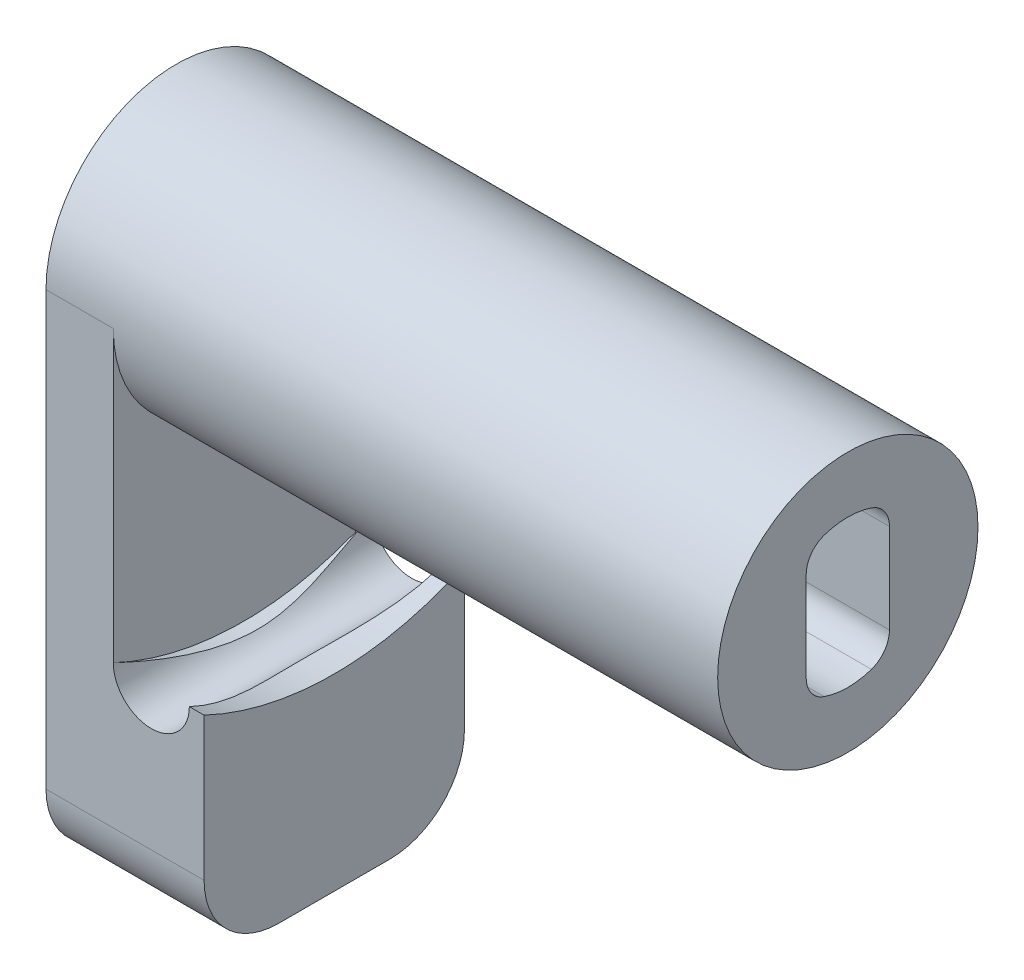
ISO-10303-21;
HEADER;
FILE_DESCRIPTION(('STEP AP214'),'2;1');
FILE_NAME('part.step','',(''),(''),'','','');
FILE_SCHEMA(('AUTOMOTIVE_DESIGN { 1 0 10303 214 1 1 1 1 }'));
ENDSEC;
DATA;
#1=APPLICATION_CONTEXT('core data for automotive mechanical design processes');
#2=APPLICATION_PROTOCOL_DEFINITION('international standard','automotive_design',2000,#1);
#3=PRODUCT_CONTEXT('',#1,'mechanical');
#4=PRODUCT('Part','Part','',(#3));
#5=PRODUCT_RELATED_PRODUCT_CATEGORY('part','',(#4));
#6=PRODUCT_DEFINITION_FORMATION('','',#4);
#7=PRODUCT_DEFINITION_CONTEXT('part definition',#1,'design');
#8=PRODUCT_DEFINITION('design','',#6,#7);
#9=PRODUCT_DEFINITION_SHAPE('','',#8);
#10=(LENGTH_UNIT() NAMED_UNIT(*) SI_UNIT(.MILLI.,.METRE.));
#11=(NAMED_UNIT(*) PLANE_ANGLE_UNIT() SI_UNIT($,.RADIAN.));
#12=(NAMED_UNIT(*) SI_UNIT($,.STERADIAN.) SOLID_ANGLE_UNIT());
#13=UNCERTAINTY_MEASURE_WITH_UNIT(LENGTH_MEASURE(1.E-05),#10,'distance_accuracy_value','');
#14=(GEOMETRIC_REPRESENTATION_CONTEXT(3) GLOBAL_UNCERTAINTY_ASSIGNED_CONTEXT((#13)) GLOBAL_UNIT_ASSIGNED_CONTEXT((#10,
#11,#12)) REPRESENTATION_CONTEXT('',''));
#15=CARTESIAN_POINT('',(0.,0.,0.));
#16=DIRECTION('',(0.,0.,1.));
#17=DIRECTION('',(1.,0.,0.));
#18=AXIS2_PLACEMENT_3D('',#15,#16,#17);
#19=CARTESIAN_POINT('',(-13.1529612058234,-1.08551700717587,0.));
#20=DIRECTION('',(1.,0.,0.));
#21=DIRECTION('',(0.,0.,-1.));
#22=AXIS2_PLACEMENT_3D('',#19,#20,#21);
#23=CYLINDRICAL_SURFACE('',#22,20.32);
#24=CARTESIAN_POINT('',(4.516000112,-19.431,-8.7376));
#25=CARTESIAN_POINT('',(4.51603731749877,-19.5177287528389,-8.5555150718596));
#26=CARTESIAN_POINT('',(4.52041756207572,-19.6017131843481,-8.37218776939642));
#27=CARTESIAN_POINT('',(4.53649669182362,-19.7640441249381,-8.00346974642191));
#28=CARTESIAN_POINT('',(4.54819196914922,-19.8423933921093,-7.81808008733202));
#29=CARTESIAN_POINT('',(4.57750524371221,-19.9932298337656,-7.44587482763609));
#30=CARTESIAN_POINT('',(4.59511059020355,-20.0657291226541,-7.25906309881219));
#31=CARTESIAN_POINT('',(4.6350984527638,-20.2050234726588,-6.88381652494582));
#32=CARTESIAN_POINT('',(4.65748161048571,-20.2718177659139,-6.69538146515752));
#33=CARTESIAN_POINT('',(4.73063386302325,-20.4648184988648,-6.12434180645761));
#34=CARTESIAN_POINT('',(4.78709294470231,-20.5822383370678,-5.73947026967527));
#35=CARTESIAN_POINT('',(4.90685418840569,-20.7938885012978,-4.9642812598655));
#36=CARTESIAN_POINT('',(4.97016061356254,-20.8881042595447,-4.57396052741235));
#37=CARTESIAN_POINT('',(5.09296430268536,-21.0504853530193,-3.80167743454365));
#38=CARTESIAN_POINT('',(5.15251770203577,-21.1194348094891,-3.41988894288582));
#39=CARTESIAN_POINT('',(5.26139557184988,-21.235522973599,-2.65150880361196));
#40=CARTESIAN_POINT('',(5.31072214253996,-21.2826661619228,-2.26491815950602));
#41=CARTESIAN_POINT('',(5.36996981115032,-21.3365954064752,-1.68338288453226));
#42=CARTESIAN_POINT('',(5.38722709898677,-21.3517501970454,-1.48994178039054));
#43=CARTESIAN_POINT('',(5.41595618999079,-21.376527934953,-1.10226762126502));
#44=CARTESIAN_POINT('',(5.42742814364184,-21.3861510261775,-0.908034587012759));
#45=CARTESIAN_POINT('',(5.44384213927347,-21.399814361787,-0.519182820192744));
#46=CARTESIAN_POINT('',(5.4487872492382,-21.4038572292324,-0.324564311936539));
#47=CARTESIAN_POINT('',(5.45182482094318,-21.4063463641171,0.0647645243224691));
#48=CARTESIAN_POINT('',(5.44991713093645,-21.4047925076236,0.25947485426309));
#49=CARTESIAN_POINT('',(5.43791560220297,-21.3949008098425,0.702031122744907));
#50=CARTESIAN_POINT('',(5.42571740508307,-21.3848170128464,0.949783737628716));
#51=CARTESIAN_POINT('',(5.39165308592273,-21.3556506908518,1.44409389752363));
#52=CARTESIAN_POINT('',(5.36978570537389,-21.3365669944351,1.69065128274307));
#53=CARTESIAN_POINT('',(5.31841361275851,-21.2894896279478,2.1824283587983));
#54=CARTESIAN_POINT('',(5.28889873312364,-21.2614840845627,2.42764582157201));
#55=CARTESIAN_POINT('',(5.22459428249614,-21.1966813330368,2.91619580195046));
#56=CARTESIAN_POINT('',(5.18980480135659,-21.1598842746537,3.15952835159059));
#57=CARTESIAN_POINT('',(5.11704832924566,-21.0773221209748,3.64572203666351));
#58=CARTESIAN_POINT('',(5.0790635160548,-21.03150451255,3.88857157186214));
#59=CARTESIAN_POINT('',(5.00229123413209,-20.931076768087,4.37232221506012));
#60=CARTESIAN_POINT('',(4.96350366591518,-20.876465536504,4.61322307635335));
#61=CARTESIAN_POINT('',(4.84906519895848,-20.6995446264881,5.332540827966));
#62=CARTESIAN_POINT('',(4.77524179271125,-20.5640491428703,5.80815334623814));
#63=CARTESIAN_POINT('',(4.68332294902369,-20.3429656895821,6.48856420455001));
#64=CARTESIAN_POINT('',(4.6570609963979,-20.2715032996002,6.69693796652465));
#65=CARTESIAN_POINT('',(4.60994604418476,-20.1216333367819,7.1117720077411));
#66=CARTESIAN_POINT('',(4.58909206679276,-20.0432270229058,7.31823262637574));
#67=CARTESIAN_POINT('',(4.55437450524215,-19.8797799982117,7.72829969041081));
#68=CARTESIAN_POINT('',(4.5404869822015,-19.7947631829191,7.93191353995666));
#69=CARTESIAN_POINT('',(4.52609874323223,-19.6621542658722,8.23548148381315));
#70=CARTESIAN_POINT('',(4.52237634337057,-19.617088565154,8.33639443081653));
#71=CARTESIAN_POINT('',(4.51732854253573,-19.525288679427,8.53753160177582));
#72=CARTESIAN_POINT('',(4.51600340983757,-19.4785543082763,8.63775574739877));
#73=CARTESIAN_POINT('',(4.516000112,-19.431,8.7376));
#74=B_SPLINE_CURVE_WITH_KNOTS('',3,(#24,#25,#26,#27,#28,#29,#30,#31,#32,#33,#34,#35,#36,#37,#38,
#39,#40,#41,#42,#43,#44,#45,#46,#47,#48,#49,#50,#51,#52,#53,#54,#55,#56,#57,#58,#59,#60,#61,#62,
#63,#64,#65,#66,#67,#68,#69,#70,#71,#72,#73),.UNSPECIFIED.,.F.,.F.,(4,2,2,2,2,2,2,2,2,2,2,2,2,2,
2,2,2,2,2,2,2,2,2,2,4),(0.,0.604902094843688,1.20950608108938,1.81282405341211,2.41622310148412,
3.6342575228127,4.8530547015255,6.02995777472376,7.20661891401831,7.79087980929366,
8.37512550645878,8.95909647731702,9.54308037958888,10.2874501190093,11.0319167716234,
11.7773783385945,12.522827208021,13.2727513586984,14.0227690103302,15.5210179611022,
16.1864245199329,16.8517106839849,17.5146947852316,17.8464021322582,18.1781465979217),.UNSPECIFIED.);
#75=CARTESIAN_POINT('',(4.516000112,-19.431,-8.7376));
#76=VERTEX_POINT('',#75);
#77=CARTESIAN_POINT('',(4.516000112,-19.431,8.7376));
#78=VERTEX_POINT('',#77);
#79=EDGE_CURVE('E228',#76,#78,#74,.T.);
#80=ORIENTED_EDGE('',*,*,#79,.F.);
#81=CARTESIAN_POINT('',(4.516000112,-1.08551700717587,0.));
#82=DIRECTION('',(-1.,0.,0.));
#83=DIRECTION('',(0.,0.,1.));
#84=AXIS2_PLACEMENT_3D('',#81,#82,#83);
#85=CIRCLE('',#84,20.32);
#86=EDGE_CURVE('E254',#76,#78,#85,.T.);
#87=ORIENTED_EDGE('',*,*,#86,.T.);
#88=EDGE_LOOP('',(#80,#87));
#89=FACE_BOUND('',#88,.T.);
#90=ADVANCED_FACE('F50',(#89),#23,.F.);
#91=CARTESIAN_POINT('',(45.085,0.,0.));
#92=DIRECTION('',(-1.,0.,0.));
#93=DIRECTION('',(0.,0.,1.));
#94=AXIS2_PLACEMENT_3D('',#91,#92,#93);
#95=CYLINDRICAL_SURFACE('',#94,8.7376);
#96=CARTESIAN_POINT('',(4.516000112,0.,0.));
#97=DIRECTION('',(-1.,0.,0.));
#98=DIRECTION('',(0.,0.,1.));
#99=AXIS2_PLACEMENT_3D('',#96,#97,#98);
#100=CIRCLE('',#99,8.7376);
#101=CARTESIAN_POINT('',(4.516000112,0.,-8.7376));
#102=VERTEX_POINT('',#101);
#103=CARTESIAN_POINT('',(4.516000112,0.,8.7376));
#104=VERTEX_POINT('',#103);
#105=EDGE_CURVE('E283',#102,#104,#100,.T.);
#106=ORIENTED_EDGE('',*,*,#105,.F.);
#107=DIRECTION('',(-1.,0.,0.));
#108=VECTOR('',#107,1.);
#109=CARTESIAN_POINT('',(4.516000112,0.,-8.7376));
#110=LINE('',#109,#108);
#111=CARTESIAN_POINT('',(0.,0.,-8.7376));
#112=VERTEX_POINT('',#111);
#113=EDGE_CURVE('E297',#102,#112,#110,.T.);
#114=ORIENTED_EDGE('',*,*,#113,.T.);
#115=CARTESIAN_POINT('',(0.,0.,0.));
#116=DIRECTION('',(1.,0.,0.));
#117=DIRECTION('',(0.,0.,-1.));
#118=AXIS2_PLACEMENT_3D('',#115,#116,#117);
#119=CIRCLE('',#118,8.7376);
#120=CARTESIAN_POINT('',(0.,0.,8.7376));
#121=VERTEX_POINT('',#120);
#122=EDGE_CURVE('E301',#112,#121,#119,.T.);
#123=ORIENTED_EDGE('',*,*,#122,.T.);
#124=DIRECTION('',(-1.,0.,0.));
#125=VECTOR('',#124,1.);
#126=CARTESIAN_POINT('',(4.516000112,0.,8.7376));
#127=LINE('',#126,#125);
#128=EDGE_CURVE('E287',#104,#121,#127,.T.);
#129=ORIENTED_EDGE('',*,*,#128,.F.);
#130=EDGE_LOOP('',(#106,#114,#123,#129));
#131=FACE_BOUND('',#130,.T.);
#132=CARTESIAN_POINT('',(45.085,0.,0.));
#133=DIRECTION('',(1.,0.,0.));
#134=DIRECTION('',(0.,0.,-1.));
#135=AXIS2_PLACEMENT_3D('',#132,#133,#134);
#136=CIRCLE('',#135,8.7376);
#137=CARTESIAN_POINT('',(45.085,0.,-8.7376));
#138=VERTEX_POINT('',#137);
#139=EDGE_CURVE('E305',#138,#138,#136,.T.);
#140=ORIENTED_EDGE('',*,*,#139,.F.);
#141=EDGE_LOOP('',(#140));
#142=FACE_BOUND('',#141,.T.);
#143=ADVANCED_FACE('F431',(#131,#142),#95,.T.);
#144=CARTESIAN_POINT('',(45.085,0.,0.));
#145=DIRECTION('',(1.,0.,0.));
#146=DIRECTION('',(0.,0.,-1.));
#147=AXIS2_PLACEMENT_3D('',#144,#145,#146);
#148=PLANE('',#147);
#149=CARTESIAN_POINT('',(45.085,0.,0.));
#150=DIRECTION('',(1.,0.,0.));
#151=DIRECTION('',(0.,0.,-1.));
#152=AXIS2_PLACEMENT_3D('',#149,#150,#151);
#153=CIRCLE('',#152,4.953);
#154=CARTESIAN_POINT('',(45.085,4.69255908842926,-1.58496));
#155=VERTEX_POINT('',#154);
#156=CARTESIAN_POINT('',(45.085,4.69255908842926,1.58496));
#157=VERTEX_POINT('',#156);
#158=EDGE_CURVE('E539',#155,#157,#153,.T.);
#159=ORIENTED_EDGE('',*,*,#158,.F.);
#160=CARTESIAN_POINT('',(45.085,3.00805069771106,-1.016));
#161=DIRECTION('',(1.,0.,0.));
#162=DIRECTION('',(0.,0.,-1.));
#163=AXIS2_PLACEMENT_3D('',#160,#161,#162);
#164=CIRCLE('',#163,1.778);
#165=CARTESIAN_POINT('',(45.085,3.00805069771106,-2.794));
#166=VERTEX_POINT('',#165);
#167=EDGE_CURVE('E372',#155,#166,#164,.F.);
#168=ORIENTED_EDGE('',*,*,#167,.T.);
#169=DIRECTION('',(0.,1.,0.));
#170=VECTOR('',#169,1.);
#171=CARTESIAN_POINT('',(45.085,-4.08971551577857,-2.794));
#172=LINE('',#171,#170);
#173=CARTESIAN_POINT('',(45.085,-3.00805069771106,-2.794));
#174=VERTEX_POINT('',#173);
#175=EDGE_CURVE('E546',#174,#166,#172,.T.);
#176=ORIENTED_EDGE('',*,*,#175,.F.);
#177=CARTESIAN_POINT('',(45.085,-3.00805069771106,-1.016));
#178=DIRECTION('',(1.,0.,0.));
#179=DIRECTION('',(0.,0.,-1.));
#180=AXIS2_PLACEMENT_3D('',#177,#178,#179);
#181=CIRCLE('',#180,1.778);
#182=CARTESIAN_POINT('',(45.085,-4.69255908842926,-1.58496));
#183=VERTEX_POINT('',#182);
#184=EDGE_CURVE('E378',#174,#183,#181,.F.);
#185=ORIENTED_EDGE('',*,*,#184,.T.);
#186=CARTESIAN_POINT('',(45.085,0.,0.));
#187=DIRECTION('',(1.,0.,0.));
#188=DIRECTION('',(0.,0.,-1.));
#189=AXIS2_PLACEMENT_3D('',#186,#187,#188);
#190=CIRCLE('',#189,4.953);
#191=CARTESIAN_POINT('',(45.085,-4.69255908842926,1.58496));
#192=VERTEX_POINT('',#191);
#193=EDGE_CURVE('E565',#192,#183,#190,.T.);
#194=ORIENTED_EDGE('',*,*,#193,.F.);
#195=CARTESIAN_POINT('',(45.085,-3.00805069771106,1.016));
#196=DIRECTION('',(1.,0.,0.));
#197=DIRECTION('',(0.,0.,-1.));
#198=AXIS2_PLACEMENT_3D('',#195,#196,#197);
#199=CIRCLE('',#198,1.778);
#200=CARTESIAN_POINT('',(45.085,-3.00805069771106,2.794));
#201=VERTEX_POINT('',#200);
#202=EDGE_CURVE('E229',#192,#201,#199,.F.);
#203=ORIENTED_EDGE('',*,*,#202,.T.);
#204=DIRECTION('',(0.,-1.,0.));
#205=VECTOR('',#204,1.);
#206=CARTESIAN_POINT('',(45.085,-4.08971551577857,2.794));
#207=LINE('',#206,#205);
#208=CARTESIAN_POINT('',(45.085,3.00805069771106,2.794));
#209=VERTEX_POINT('',#208);
#210=EDGE_CURVE('E561',#209,#201,#207,.T.);
#211=ORIENTED_EDGE('',*,*,#210,.F.);
#212=CARTESIAN_POINT('',(45.085,3.00805069771106,1.016));
#213=DIRECTION('',(1.,0.,0.));
#214=DIRECTION('',(0.,0.,-1.));
#215=AXIS2_PLACEMENT_3D('',#212,#213,#214);
#216=CIRCLE('',#215,1.778);
#217=EDGE_CURVE('E375',#209,#157,#216,.F.);
#218=ORIENTED_EDGE('',*,*,#217,.T.);
#219=EDGE_LOOP('',(#159,#168,#176,#185,#194,#203,#211,#218));
#220=FACE_BOUND('',#219,.T.);
#221=ORIENTED_EDGE('',*,*,#139,.T.);
#222=EDGE_LOOP('',(#221));
#223=FACE_BOUND('',#222,.T.);
#224=ADVANCED_FACE('F438',(#220,#223),#148,.T.);
#225=CARTESIAN_POINT('',(0.,0.,0.));
#226=DIRECTION('',(1.,0.,0.));
#227=DIRECTION('',(0.,0.,-1.));
#228=AXIS2_PLACEMENT_3D('',#225,#226,#227);
#229=PLANE('',#228);
#230=CARTESIAN_POINT('',(0.,0.,0.));
#231=DIRECTION('',(-1.,0.,0.));
#232=DIRECTION('',(0.,0.,1.));
#233=AXIS2_PLACEMENT_3D('',#230,#231,#232);
#234=CIRCLE('',#233,4.064);
#235=CARTESIAN_POINT('',(0.,-3.57996192448434,1.92353024911032));
#236=VERTEX_POINT('',#235);
#237=CARTESIAN_POINT('',(0.,-3.57996192448434,-1.92353024911032));
#238=VERTEX_POINT('',#237);
#239=EDGE_CURVE('E530',#236,#238,#234,.T.);
#240=ORIENTED_EDGE('',*,*,#239,.F.);
#241=CARTESIAN_POINT('',(0.,-3.92956758117226,2.111375));
#242=DIRECTION('',(1.,0.,0.));
#243=DIRECTION('',(0.,0.,-1.));
#244=AXIS2_PLACEMENT_3D('',#241,#242,#243);
#245=CIRCLE('',#244,0.396875);
#246=CARTESIAN_POINT('',(0.,-3.92956758117226,1.7145));
#247=VERTEX_POINT('',#246);
#248=EDGE_CURVE('E457',#236,#247,#245,.F.);
#249=ORIENTED_EDGE('',*,*,#248,.T.);
#250=DIRECTION('',(0.,1.,0.));
#251=VECTOR('',#250,1.);
#252=CARTESIAN_POINT('',(0.,-3.68464187540662,1.7145));
#253=LINE('',#252,#251);
#254=CARTESIAN_POINT('',(0.,-5.19276687540662,1.7145));
#255=VERTEX_POINT('',#254);
#256=EDGE_CURVE('E501',#255,#247,#253,.T.);
#257=ORIENTED_EDGE('',*,*,#256,.F.);
#258=CARTESIAN_POINT('',(0.,-5.19276687540662,1.317625));
#259=DIRECTION('',(1.,0.,0.));
#260=DIRECTION('',(0.,0.,-1.));
#261=AXIS2_PLACEMENT_3D('',#258,#259,#260);
#262=CIRCLE('',#261,0.396875);
#263=CARTESIAN_POINT('',(0.,-5.58964187540662,1.317625));
#264=VERTEX_POINT('',#263);
#265=EDGE_CURVE('E489',#255,#264,#262,.T.);
#266=ORIENTED_EDGE('',*,*,#265,.T.);
#267=DIRECTION('',(0.,0.,1.));
#268=VECTOR('',#267,1.);
#269=CARTESIAN_POINT('',(0.,-5.58964187540662,1.7145));
#270=LINE('',#269,#268);
#271=CARTESIAN_POINT('',(0.,-5.58964187540662,-1.317625));
#272=VERTEX_POINT('',#271);
#273=EDGE_CURVE('E499',#272,#264,#270,.T.);
#274=ORIENTED_EDGE('',*,*,#273,.F.);
#275=CARTESIAN_POINT('',(0.,-5.19276687540662,-1.317625));
#276=DIRECTION('',(1.,0.,0.));
#277=DIRECTION('',(0.,0.,-1.));
#278=AXIS2_PLACEMENT_3D('',#275,#276,#277);
#279=CIRCLE('',#278,0.396875);
#280=CARTESIAN_POINT('',(0.,-5.19276687540662,-1.7145));
#281=VERTEX_POINT('',#280);
#282=EDGE_CURVE('E12',#272,#281,#279,.T.);
#283=ORIENTED_EDGE('',*,*,#282,.T.);
#284=DIRECTION('',(0.,-1.,0.));
#285=VECTOR('',#284,1.);
#286=CARTESIAN_POINT('',(0.,-3.68464187540662,-1.7145));
#287=LINE('',#286,#285);
#288=CARTESIAN_POINT('',(0.,-3.92956758117226,-1.7145));
#289=VERTEX_POINT('',#288);
#290=EDGE_CURVE('E511',#289,#281,#287,.T.);
#291=ORIENTED_EDGE('',*,*,#290,.F.);
#292=CARTESIAN_POINT('',(0.,-3.92956758117226,-2.111375));
#293=DIRECTION('',(1.,0.,0.));
#294=DIRECTION('',(0.,0.,-1.));
#295=AXIS2_PLACEMENT_3D('',#292,#293,#294);
#296=CIRCLE('',#295,0.396875);
#297=EDGE_CURVE('E452',#289,#238,#296,.F.);
#298=ORIENTED_EDGE('',*,*,#297,.T.);
#299=EDGE_LOOP('',(#240,#249,#257,#266,#274,#283,#291,#298));
#300=FACE_BOUND('',#299,.T.);
#301=DIRECTION('',(0.,0.,-1.));
#302=VECTOR('',#301,1.);
#303=CARTESIAN_POINT('',(0.,-34.036,0.));
#304=LINE('',#303,#302);
#305=CARTESIAN_POINT('',(0.,-34.036,3.7376));
#306=VERTEX_POINT('',#305);
#307=CARTESIAN_POINT('',(0.,-34.036,-3.7376));
#308=VERTEX_POINT('',#307);
#309=EDGE_CURVE('E290',#306,#308,#304,.T.);
#310=ORIENTED_EDGE('',*,*,#309,.F.);
#311=CARTESIAN_POINT('',(0.,-29.036,3.7376));
#312=DIRECTION('',(1.,0.,0.));
#313=DIRECTION('',(0.,0.,-1.));
#314=AXIS2_PLACEMENT_3D('',#311,#312,#313);
#315=CIRCLE('',#314,5.);
#316=CARTESIAN_POINT('',(0.,-29.036,8.7376));
#317=VERTEX_POINT('',#316);
#318=EDGE_CURVE('E321',#306,#317,#315,.F.);
#319=ORIENTED_EDGE('',*,*,#318,.T.);
#320=DIRECTION('',(0.,-1.,0.));
#321=VECTOR('',#320,1.);
#322=CARTESIAN_POINT('',(0.,0.,8.7376));
#323=LINE('',#322,#321);
#324=EDGE_CURVE('E279',#121,#317,#323,.T.);
#325=ORIENTED_EDGE('',*,*,#324,.F.);
#326=ORIENTED_EDGE('',*,*,#122,.F.);
#327=DIRECTION('',(0.,1.,0.));
#328=VECTOR('',#327,1.);
#329=CARTESIAN_POINT('',(0.,0.,-8.7376));
#330=LINE('',#329,#328);
#331=CARTESIAN_POINT('',(0.,-29.036,-8.7376));
#332=VERTEX_POINT('',#331);
#333=EDGE_CURVE('E275',#332,#112,#330,.T.);
#334=ORIENTED_EDGE('',*,*,#333,.F.);
#335=CARTESIAN_POINT('',(0.,-29.036,-3.7376));
#336=DIRECTION('',(1.,0.,0.));
#337=DIRECTION('',(0.,0.,-1.));
#338=AXIS2_PLACEMENT_3D('',#335,#336,#337);
#339=CIRCLE('',#338,5.);
#340=EDGE_CURVE('E318',#332,#308,#339,.F.);
#341=ORIENTED_EDGE('',*,*,#340,.T.);
#342=EDGE_LOOP('',(#310,#319,#325,#326,#334,#341));
#343=FACE_BOUND('',#342,.T.);
#344=ADVANCED_FACE('F497',(#300,#343),#229,.F.);
#345=CARTESIAN_POINT('',(4.516000112,0.,-8.7376));
#346=DIRECTION('',(0.,0.,1.));
#347=DIRECTION('',(0.,-1.,0.));
#348=AXIS2_PLACEMENT_3D('',#345,#346,#347);
#349=PLANE('',#348);
#350=DIRECTION('',(0.,1.,0.));
#351=VECTOR('',#350,1.);
#352=CARTESIAN_POINT('',(4.516000112,0.,-8.7376));
#353=LINE('',#352,#351);
#354=EDGE_CURVE('E238',#76,#102,#353,.T.);
#355=ORIENTED_EDGE('',*,*,#354,.F.);
#356=CARTESIAN_POINT('',(7.068700112,-19.431,-8.7376));
#357=DIRECTION('',(0.,0.,-1.));
#358=DIRECTION('',(0.,1.,0.));
#359=AXIS2_PLACEMENT_3D('',#356,#357,#358);
#360=CIRCLE('',#359,2.5527);
#361=CARTESIAN_POINT('',(9.621400112,-19.431,-8.7376));
#362=VERTEX_POINT('',#361);
#363=EDGE_CURVE('E220',#362,#76,#360,.T.);
#364=ORIENTED_EDGE('',*,*,#363,.F.);
#365=DIRECTION('',(1.,0.,0.));
#366=VECTOR('',#365,1.);
#367=CARTESIAN_POINT('',(-13.1529612058234,-19.431,-8.7376));
#368=LINE('',#367,#366);
#369=CARTESIAN_POINT('',(10.612000112,-19.431,-8.7376));
#370=VERTEX_POINT('',#369);
#371=EDGE_CURVE('E235',#362,#370,#368,.T.);
#372=ORIENTED_EDGE('',*,*,#371,.T.);
#373=DIRECTION('',(0.,1.,0.));
#374=VECTOR('',#373,1.);
#375=CARTESIAN_POINT('',(10.612000112,0.,-8.7376));
#376=LINE('',#375,#374);
#377=CARTESIAN_POINT('',(10.612000112,-29.036,-8.7376));
#378=VERTEX_POINT('',#377);
#379=EDGE_CURVE('E272',#378,#370,#376,.T.);
#380=ORIENTED_EDGE('',*,*,#379,.F.);
#381=DIRECTION('',(-1.,0.,0.));
#382=VECTOR('',#381,1.);
#383=CARTESIAN_POINT('',(4.516000112,-29.036,-8.7376));
#384=LINE('',#383,#382);
#385=EDGE_CURVE('E328',#378,#332,#384,.T.);
#386=ORIENTED_EDGE('',*,*,#385,.T.);
#387=ORIENTED_EDGE('',*,*,#333,.T.);
#388=ORIENTED_EDGE('',*,*,#113,.F.);
#389=EDGE_LOOP('',(#355,#364,#372,#380,#386,#387,#388));
#390=FACE_BOUND('',#389,.T.);
#391=ADVANCED_FACE('F233',(#390),#349,.F.);
#392=CARTESIAN_POINT('',(4.516000112,0.,8.7376));
#393=DIRECTION('',(0.,0.,-1.));
#394=DIRECTION('',(0.,1.,0.));
#395=AXIS2_PLACEMENT_3D('',#392,#393,#394);
#396=PLANE('',#395);
#397=DIRECTION('',(1.,0.,0.));
#398=VECTOR('',#397,1.);
#399=CARTESIAN_POINT('',(-13.1529612058234,-19.431,8.7376));
#400=LINE('',#399,#398);
#401=CARTESIAN_POINT('',(9.621400112,-19.431,8.7376));
#402=VERTEX_POINT('',#401);
#403=CARTESIAN_POINT('',(10.612000112,-19.431,8.7376));
#404=VERTEX_POINT('',#403);
#405=EDGE_CURVE('E248',#402,#404,#400,.T.);
#406=ORIENTED_EDGE('',*,*,#405,.F.);
#407=CARTESIAN_POINT('',(7.068700112,-19.431,8.7376));
#408=DIRECTION('',(0.,0.,-1.));
#409=DIRECTION('',(0.,1.,0.));
#410=AXIS2_PLACEMENT_3D('',#407,#408,#409);
#411=CIRCLE('',#410,2.5527);
#412=EDGE_CURVE('E223',#402,#78,#411,.T.);
#413=ORIENTED_EDGE('',*,*,#412,.T.);
#414=DIRECTION('',(0.,-1.,0.));
#415=VECTOR('',#414,1.);
#416=CARTESIAN_POINT('',(4.516000112,0.,8.7376));
#417=LINE('',#416,#415);
#418=EDGE_CURVE('E278',#104,#78,#417,.T.);
#419=ORIENTED_EDGE('',*,*,#418,.F.);
#420=ORIENTED_EDGE('',*,*,#128,.T.);
#421=ORIENTED_EDGE('',*,*,#324,.T.);
#422=DIRECTION('',(-1.,0.,0.));
#423=VECTOR('',#422,1.);
#424=CARTESIAN_POINT('',(4.516000112,-29.036,8.7376));
#425=LINE('',#424,#423);
#426=CARTESIAN_POINT('',(10.612000112,-29.036,8.7376));
#427=VERTEX_POINT('',#426);
#428=EDGE_CURVE('E324',#317,#427,#425,.F.);
#429=ORIENTED_EDGE('',*,*,#428,.T.);
#430=DIRECTION('',(0.,-1.,0.));
#431=VECTOR('',#430,1.);
#432=CARTESIAN_POINT('',(10.612000112,0.,8.7376));
#433=LINE('',#432,#431);
#434=EDGE_CURVE('E252',#404,#427,#433,.T.);
#435=ORIENTED_EDGE('',*,*,#434,.F.);
#436=EDGE_LOOP('',(#406,#413,#419,#420,#421,#429,#435));
#437=FACE_BOUND('',#436,.T.);
#438=ADVANCED_FACE('F798',(#437),#396,.F.);
#439=CARTESIAN_POINT('',(4.516000112,-34.036,0.));
#440=DIRECTION('',(0.,1.,0.));
#441=DIRECTION('',(0.,0.,1.));
#442=AXIS2_PLACEMENT_3D('',#439,#440,#441);
#443=PLANE('',#442);
#444=DIRECTION('',(-1.,0.,0.));
#445=VECTOR('',#444,1.);
#446=CARTESIAN_POINT('',(4.516000112,-34.036,-3.7376));
#447=LINE('',#446,#445);
#448=CARTESIAN_POINT('',(10.612000112,-34.036,-3.7376));
#449=VERTEX_POINT('',#448);
#450=EDGE_CURVE('E309',#308,#449,#447,.F.);
#451=ORIENTED_EDGE('',*,*,#450,.T.);
#452=DIRECTION('',(0.,0.,-1.));
#453=VECTOR('',#452,1.);
#454=CARTESIAN_POINT('',(10.612000112,-34.036,0.));
#455=LINE('',#454,#453);
#456=CARTESIAN_POINT('',(10.612000112,-34.036,3.7376));
#457=VERTEX_POINT('',#456);
#458=EDGE_CURVE('E264',#457,#449,#455,.T.);
#459=ORIENTED_EDGE('',*,*,#458,.F.);
#460=DIRECTION('',(-1.,0.,0.));
#461=VECTOR('',#460,1.);
#462=CARTESIAN_POINT('',(4.516000112,-34.036,3.7376));
#463=LINE('',#462,#461);
#464=EDGE_CURVE('E314',#457,#306,#463,.T.);
#465=ORIENTED_EDGE('',*,*,#464,.T.);
#466=ORIENTED_EDGE('',*,*,#309,.T.);
#467=EDGE_LOOP('',(#451,#459,#465,#466));
#468=FACE_BOUND('',#467,.T.);
#469=ADVANCED_FACE('F789',(#468),#443,.F.);
#470=CARTESIAN_POINT('',(4.516000112,0.,0.));
#471=DIRECTION('',(-1.,0.,0.));
#472=DIRECTION('',(0.,0.,1.));
#473=AXIS2_PLACEMENT_3D('',#470,#471,#472);
#474=PLANE('',#473);
#475=ORIENTED_EDGE('',*,*,#418,.T.);
#476=ORIENTED_EDGE('',*,*,#86,.F.);
#477=ORIENTED_EDGE('',*,*,#354,.T.);
#478=ORIENTED_EDGE('',*,*,#105,.T.);
#479=EDGE_LOOP('',(#475,#476,#477,#478));
#480=FACE_BOUND('',#479,.T.);
#481=ADVANCED_FACE('F614',(#480),#474,.F.);
#482=CARTESIAN_POINT('',(4.516000112,-29.036,3.7376));
#483=DIRECTION('',(-1.,0.,0.));
#484=DIRECTION('',(0.,0.,1.));
#485=AXIS2_PLACEMENT_3D('',#482,#483,#484);
#486=CYLINDRICAL_SURFACE('',#485,5.);
#487=ORIENTED_EDGE('',*,*,#464,.F.);
#488=CARTESIAN_POINT('',(10.612000112,-29.036,3.7376));
#489=DIRECTION('',(1.,0.,0.));
#490=DIRECTION('',(0.,0.,-1.));
#491=AXIS2_PLACEMENT_3D('',#488,#489,#490);
#492=CIRCLE('',#491,5.);
#493=EDGE_CURVE('E260',#427,#457,#492,.T.);
#494=ORIENTED_EDGE('',*,*,#493,.F.);
#495=ORIENTED_EDGE('',*,*,#428,.F.);
#496=ORIENTED_EDGE('',*,*,#318,.F.);
#497=EDGE_LOOP('',(#487,#494,#495,#496));
#498=FACE_BOUND('',#497,.T.);
#499=ADVANCED_FACE('F610',(#498),#486,.T.);
#500=CARTESIAN_POINT('',(4.516000112,-29.036,-3.7376));
#501=DIRECTION('',(-1.,0.,0.));
#502=DIRECTION('',(0.,0.,1.));
#503=AXIS2_PLACEMENT_3D('',#500,#501,#502);
#504=CYLINDRICAL_SURFACE('',#503,5.);
#505=ORIENTED_EDGE('',*,*,#385,.F.);
#506=CARTESIAN_POINT('',(10.612000112,-29.036,-3.7376));
#507=DIRECTION('',(1.,0.,0.));
#508=DIRECTION('',(0.,0.,-1.));
#509=AXIS2_PLACEMENT_3D('',#506,#507,#508);
#510=CIRCLE('',#509,5.);
#511=EDGE_CURVE('E268',#449,#378,#510,.T.);
#512=ORIENTED_EDGE('',*,*,#511,.F.);
#513=ORIENTED_EDGE('',*,*,#450,.F.);
#514=ORIENTED_EDGE('',*,*,#340,.F.);
#515=EDGE_LOOP('',(#505,#512,#513,#514));
#516=FACE_BOUND('',#515,.T.);
#517=ADVANCED_FACE('F613',(#516),#504,.T.);
#518=CARTESIAN_POINT('',(10.612000112,0.,0.));
#519=DIRECTION('',(1.,0.,0.));
#520=DIRECTION('',(0.,0.,-1.));
#521=AXIS2_PLACEMENT_3D('',#518,#519,#520);
#522=PLANE('',#521);
#523=ORIENTED_EDGE('',*,*,#379,.T.);
#524=CARTESIAN_POINT('',(10.612000112,-1.08551700717587,0.));
#525=DIRECTION('',(1.,0.,0.));
#526=DIRECTION('',(0.,0.,-1.));
#527=AXIS2_PLACEMENT_3D('',#524,#525,#526);
#528=CIRCLE('',#527,20.32);
#529=EDGE_CURVE('E245',#370,#404,#528,.F.);
#530=ORIENTED_EDGE('',*,*,#529,.T.);
#531=ORIENTED_EDGE('',*,*,#434,.T.);
#532=ORIENTED_EDGE('',*,*,#493,.T.);
#533=ORIENTED_EDGE('',*,*,#458,.T.);
#534=ORIENTED_EDGE('',*,*,#511,.T.);
#535=EDGE_LOOP('',(#523,#530,#531,#532,#533,#534));
#536=FACE_BOUND('',#535,.T.);
#537=ADVANCED_FACE('F428',(#536),#522,.T.);
#538=CARTESIAN_POINT('',(9.621400112,-19.431,8.73760000000001));
#539=CARTESIAN_POINT('',(9.62136290650122,-19.5177287528389,8.55551507185961));
#540=CARTESIAN_POINT('',(9.61698266192428,-19.6017131843481,8.37218776939643));
#541=CARTESIAN_POINT('',(9.60090353217638,-19.7640441249381,8.00346974642192));
#542=CARTESIAN_POINT('',(9.58920825485078,-19.8423933921093,7.81808008733204));
#543=CARTESIAN_POINT('',(9.55989498028779,-19.9932298337656,7.4458748276361));
#544=CARTESIAN_POINT('',(9.54228963379645,-20.0657291226541,7.25906309881221));
#545=CARTESIAN_POINT('',(9.5023017712362,-20.2050234726588,6.88381652494584));
#546=CARTESIAN_POINT('',(9.47991861351429,-20.2718177659139,6.69538146515754));
#547=CARTESIAN_POINT('',(9.40676636097675,-20.4648184988648,6.12434180645763));
#548=CARTESIAN_POINT('',(9.35030727929769,-20.5822383370678,5.73947026967529));
#549=CARTESIAN_POINT('',(9.23054603559431,-20.7938885012978,4.96428125986553));
#550=CARTESIAN_POINT('',(9.16723961043746,-20.8881042595446,4.57396052741238));
#551=CARTESIAN_POINT('',(9.04443592131464,-21.0504853530193,3.80167743454368));
#552=CARTESIAN_POINT('',(8.98488252196424,-21.1194348094891,3.41988894288584));
#553=CARTESIAN_POINT('',(8.87600465215012,-21.235522973599,2.65150880361197));
#554=CARTESIAN_POINT('',(8.82667808146003,-21.2826661619228,2.26491815950603));
#555=CARTESIAN_POINT('',(8.76743041284968,-21.3365954064752,1.68338288453227));
#556=CARTESIAN_POINT('',(8.75017312501324,-21.3517501970454,1.48994178039055));
#557=CARTESIAN_POINT('',(8.72144403400921,-21.376527934953,1.10226762126502));
#558=CARTESIAN_POINT('',(8.70997208035815,-21.3861510261775,0.908034587012754));
#559=CARTESIAN_POINT('',(8.69355808472652,-21.399814361787,0.519182820192736));
#560=CARTESIAN_POINT('',(8.6886129747618,-21.4038572292324,0.324564311936529));
#561=CARTESIAN_POINT('',(8.68557540305681,-21.4063463641171,-0.0647645243224828));
#562=CARTESIAN_POINT('',(8.68748309306355,-21.4047925076236,-0.259474854263106));
#563=CARTESIAN_POINT('',(8.69948462179703,-21.3949008098425,-0.702031122744926));
#564=CARTESIAN_POINT('',(8.71168281891693,-21.3848170128464,-0.949783737628736));
#565=CARTESIAN_POINT('',(8.74574713807727,-21.3556506908518,-1.44409389752365));
#566=CARTESIAN_POINT('',(8.76761451862611,-21.3365669944351,-1.69065128274309));
#567=CARTESIAN_POINT('',(8.8189866112415,-21.2894896279478,-2.18242835879833));
#568=CARTESIAN_POINT('',(8.84850149087637,-21.2614840845627,-2.42764582157203));
#569=CARTESIAN_POINT('',(8.91280594150386,-21.1966813330368,-2.91619580195049));
#570=CARTESIAN_POINT('',(8.94759542264341,-21.1598842746537,-3.15952835159061));
#571=CARTESIAN_POINT('',(9.02035189475434,-21.0773221209747,-3.64572203666354));
#572=CARTESIAN_POINT('',(9.0583367079452,-21.0315045125499,-3.88857157186217));
#573=CARTESIAN_POINT('',(9.13510898986792,-20.931076768087,-4.37232221506015));
#574=CARTESIAN_POINT('',(9.17389655808482,-20.876465536504,-4.61322307635338));
#575=CARTESIAN_POINT('',(9.28833502504152,-20.6995446264881,-5.33254082796604));
#576=CARTESIAN_POINT('',(9.36215843128875,-20.5640491428703,-5.80815334623818));
#577=CARTESIAN_POINT('',(9.45407727497632,-20.3429656895821,-6.48856420455005));
#578=CARTESIAN_POINT('',(9.4803392276021,-20.2715032996002,-6.69693796652469));
#579=CARTESIAN_POINT('',(9.52745417981524,-20.1216333367819,-7.11177200774113));
#580=CARTESIAN_POINT('',(9.54830815720724,-20.0432270229058,-7.31823262637576));
#581=CARTESIAN_POINT('',(9.58302571875785,-19.8797799982117,-7.72829969041083));
#582=CARTESIAN_POINT('',(9.59691324179849,-19.7947631829191,-7.93191353995668));
#583=CARTESIAN_POINT('',(9.61130148076776,-19.6621542658722,-8.23548148381315));
#584=CARTESIAN_POINT('',(9.61502388062943,-19.617088565154,-8.33639443081653));
#585=CARTESIAN_POINT('',(9.62007168146426,-19.525288679427,-8.53753160177582));
#586=CARTESIAN_POINT('',(9.62139681416243,-19.4785543082763,-8.63775574739877));
#587=CARTESIAN_POINT('',(9.621400112,-19.431,-8.7376));
#588=B_SPLINE_CURVE_WITH_KNOTS('',3,(#538,#539,#540,#541,#542,#543,#544,#545,#546,#547,#548,
#549,#550,#551,#552,#553,#554,#555,#556,#557,#558,#559,#560,#561,#562,#563,#564,#565,#566,#567,
#568,#569,#570,#571,#572,#573,#574,#575,#576,#577,#578,#579,#580,#581,#582,#583,#584,#585,#586,
#587),.UNSPECIFIED.,.F.,.F.,(4,2,2,2,2,2,2,2,2,2,2,2,2,2,2,2,2,2,2,2,2,2,2,2,4),(0.,
0.604902094843686,1.20950608108937,1.81282405341211,2.41622310148411,3.63425752281268,
4.85305470152548,6.02995777472375,7.20661891401831,7.79087980929367,8.37512550645879,
8.95909647731704,9.5430803795889,10.2874501190093,11.0319167716235,11.7773783385945,
12.5228272080211,13.2727513586984,14.0227690103302,15.5210179611022,16.1864245199329,
16.851710683985,17.5146947852316,17.8464021322582,18.1781465979217),.UNSPECIFIED.);
#589=EDGE_CURVE('E217',#402,#362,#588,.T.);
#590=ORIENTED_EDGE('',*,*,#589,.F.);
#591=ORIENTED_EDGE('',*,*,#405,.T.);
#592=ORIENTED_EDGE('',*,*,#529,.F.);
#593=ORIENTED_EDGE('',*,*,#371,.F.);
#594=EDGE_LOOP('',(#590,#591,#592,#593));
#595=FACE_BOUND('',#594,.T.);
#596=ADVANCED_FACE('F243',(#595),#23,.F.);
#597=CARTESIAN_POINT('',(32.893,0.,0.));
#598=DIRECTION('',(1.,0.,0.));
#599=DIRECTION('',(0.,0.,-1.));
#600=AXIS2_PLACEMENT_3D('',#597,#598,#599);
#601=CYLINDRICAL_SURFACE('',#600,4.953);
#602=CARTESIAN_POINT('',(32.893,0.,0.));
#603=DIRECTION('',(1.,0.,0.));
#604=DIRECTION('',(0.,0.,-1.));
#605=AXIS2_PLACEMENT_3D('',#602,#603,#604);
#606=CIRCLE('',#605,4.953);
#607=CARTESIAN_POINT('',(32.893,4.69255908842926,-1.58496));
#608=VERTEX_POINT('',#607);
#609=CARTESIAN_POINT('',(32.893,4.69255908842926,1.58496));
#610=VERTEX_POINT('',#609);
#611=EDGE_CURVE('E541',#608,#610,#606,.T.);
#612=ORIENTED_EDGE('',*,*,#611,.F.);
#613=DIRECTION('',(1.,0.,0.));
#614=VECTOR('',#613,1.);
#615=CARTESIAN_POINT('',(32.893,4.69255908842926,-1.58496));
#616=LINE('',#615,#614);
#617=EDGE_CURVE('E335',#608,#155,#616,.T.);
#618=ORIENTED_EDGE('',*,*,#617,.T.);
#619=ORIENTED_EDGE('',*,*,#158,.T.);
#620=DIRECTION('',(1.,0.,0.));
#621=VECTOR('',#620,1.);
#622=CARTESIAN_POINT('',(32.893,4.69255908842926,1.58496));
#623=LINE('',#622,#621);
#624=EDGE_CURVE('E332',#157,#610,#623,.F.);
#625=ORIENTED_EDGE('',*,*,#624,.T.);
#626=EDGE_LOOP('',(#612,#618,#619,#625));
#627=FACE_BOUND('',#626,.T.);
#628=ADVANCED_FACE('F415',(#627),#601,.F.);
#629=CARTESIAN_POINT('',(32.893,-4.08971551577857,-2.794));
#630=DIRECTION('',(0.,0.,-1.));
#631=DIRECTION('',(-1.,0.,0.));
#632=AXIS2_PLACEMENT_3D('',#629,#630,#631);
#633=PLANE('',#632);
#634=ORIENTED_EDGE('',*,*,#175,.T.);
#635=DIRECTION('',(-1.,0.,0.));
#636=VECTOR('',#635,1.);
#637=CARTESIAN_POINT('',(32.893,3.00805069771106,-2.794));
#638=LINE('',#637,#636);
#639=CARTESIAN_POINT('',(32.893,3.00805069771106,-2.794));
#640=VERTEX_POINT('',#639);
#641=EDGE_CURVE('E343',#166,#640,#638,.T.);
#642=ORIENTED_EDGE('',*,*,#641,.T.);
#643=DIRECTION('',(0.,1.,0.));
#644=VECTOR('',#643,1.);
#645=CARTESIAN_POINT('',(32.893,-4.08971551577857,-2.794));
#646=LINE('',#645,#644);
#647=CARTESIAN_POINT('',(32.893,-3.00805069771106,-2.794));
#648=VERTEX_POINT('',#647);
#649=EDGE_CURVE('E554',#648,#640,#646,.T.);
#650=ORIENTED_EDGE('',*,*,#649,.F.);
#651=DIRECTION('',(-1.,0.,0.));
#652=VECTOR('',#651,1.);
#653=CARTESIAN_POINT('',(45.085,-3.00805069771106,-2.794));
#654=LINE('',#653,#652);
#655=EDGE_CURVE('E339',#648,#174,#654,.F.);
#656=ORIENTED_EDGE('',*,*,#655,.T.);
#657=EDGE_LOOP('',(#634,#642,#650,#656));
#658=FACE_BOUND('',#657,.T.);
#659=ADVANCED_FACE('F411',(#658),#633,.F.);
#660=CARTESIAN_POINT('',(32.893,0.,0.));
#661=DIRECTION('',(1.,0.,0.));
#662=DIRECTION('',(0.,0.,-1.));
#663=AXIS2_PLACEMENT_3D('',#660,#661,#662);
#664=CYLINDRICAL_SURFACE('',#663,4.953);
#665=ORIENTED_EDGE('',*,*,#193,.T.);
#666=DIRECTION('',(1.,0.,0.));
#667=VECTOR('',#666,1.);
#668=CARTESIAN_POINT('',(32.893,-4.69255908842926,-1.58496));
#669=LINE('',#668,#667);
#670=CARTESIAN_POINT('',(32.893,-4.69255908842926,-1.58496));
#671=VERTEX_POINT('',#670);
#672=EDGE_CURVE('E369',#183,#671,#669,.F.);
#673=ORIENTED_EDGE('',*,*,#672,.T.);
#674=CARTESIAN_POINT('',(32.893,0.,0.));
#675=DIRECTION('',(1.,0.,0.));
#676=DIRECTION('',(0.,0.,-1.));
#677=AXIS2_PLACEMENT_3D('',#674,#675,#676);
#678=CIRCLE('',#677,4.953);
#679=CARTESIAN_POINT('',(32.893,-4.69255908842926,1.58496));
#680=VERTEX_POINT('',#679);
#681=EDGE_CURVE('E550',#680,#671,#678,.T.);
#682=ORIENTED_EDGE('',*,*,#681,.F.);
#683=DIRECTION('',(1.,0.,0.));
#684=VECTOR('',#683,1.);
#685=CARTESIAN_POINT('',(32.893,-4.69255908842926,1.58496));
#686=LINE('',#685,#684);
#687=EDGE_CURVE('E365',#680,#192,#686,.T.);
#688=ORIENTED_EDGE('',*,*,#687,.T.);
#689=EDGE_LOOP('',(#665,#673,#682,#688));
#690=FACE_BOUND('',#689,.T.);
#691=ADVANCED_FACE('F414',(#690),#664,.F.);
#692=CARTESIAN_POINT('',(32.893,-4.08971551577857,2.794));
#693=DIRECTION('',(0.,0.,1.));
#694=DIRECTION('',(1.,0.,0.));
#695=AXIS2_PLACEMENT_3D('',#692,#693,#694);
#696=PLANE('',#695);
#697=DIRECTION('',(0.,-1.,0.));
#698=VECTOR('',#697,1.);
#699=CARTESIAN_POINT('',(32.893,-4.08971551577857,2.794));
#700=LINE('',#699,#698);
#701=CARTESIAN_POINT('',(32.893,3.00805069771106,2.794));
#702=VERTEX_POINT('',#701);
#703=CARTESIAN_POINT('',(32.893,-3.00805069771106,2.794));
#704=VERTEX_POINT('',#703);
#705=EDGE_CURVE('E545',#702,#704,#700,.T.);
#706=ORIENTED_EDGE('',*,*,#705,.F.);
#707=DIRECTION('',(-1.,0.,0.));
#708=VECTOR('',#707,1.);
#709=CARTESIAN_POINT('',(45.085,3.00805069771106,2.794));
#710=LINE('',#709,#708);
#711=EDGE_CURVE('E361',#702,#209,#710,.F.);
#712=ORIENTED_EDGE('',*,*,#711,.T.);
#713=ORIENTED_EDGE('',*,*,#210,.T.);
#714=DIRECTION('',(-1.,0.,0.));
#715=VECTOR('',#714,1.);
#716=CARTESIAN_POINT('',(32.893,-3.00805069771106,2.794));
#717=LINE('',#716,#715);
#718=EDGE_CURVE('E358',#201,#704,#717,.T.);
#719=ORIENTED_EDGE('',*,*,#718,.T.);
#720=EDGE_LOOP('',(#706,#712,#713,#719));
#721=FACE_BOUND('',#720,.T.);
#722=ADVANCED_FACE('F409',(#721),#696,.F.);
#723=CARTESIAN_POINT('',(32.893,0.,0.));
#724=DIRECTION('',(1.,0.,0.));
#725=DIRECTION('',(0.,0.,-1.));
#726=AXIS2_PLACEMENT_3D('',#723,#724,#725);
#727=PLANE('',#726);
#728=ORIENTED_EDGE('',*,*,#649,.T.);
#729=CARTESIAN_POINT('',(32.893,3.00805069771106,-1.016));
#730=DIRECTION('',(1.,0.,0.));
#731=DIRECTION('',(0.,0.,-1.));
#732=AXIS2_PLACEMENT_3D('',#729,#730,#731);
#733=CIRCLE('',#732,1.778);
#734=EDGE_CURVE('E355',#640,#608,#733,.T.);
#735=ORIENTED_EDGE('',*,*,#734,.T.);
#736=ORIENTED_EDGE('',*,*,#611,.T.);
#737=CARTESIAN_POINT('',(32.893,3.00805069771106,1.016));
#738=DIRECTION('',(1.,0.,0.));
#739=DIRECTION('',(0.,0.,-1.));
#740=AXIS2_PLACEMENT_3D('',#737,#738,#739);
#741=CIRCLE('',#740,1.778);
#742=EDGE_CURVE('E352',#610,#702,#741,.T.);
#743=ORIENTED_EDGE('',*,*,#742,.T.);
#744=ORIENTED_EDGE('',*,*,#705,.T.);
#745=CARTESIAN_POINT('',(32.893,-3.00805069771106,1.016));
#746=DIRECTION('',(1.,0.,0.));
#747=DIRECTION('',(0.,0.,-1.));
#748=AXIS2_PLACEMENT_3D('',#745,#746,#747);
#749=CIRCLE('',#748,1.778);
#750=EDGE_CURVE('E346',#704,#680,#749,.T.);
#751=ORIENTED_EDGE('',*,*,#750,.T.);
#752=ORIENTED_EDGE('',*,*,#681,.T.);
#753=CARTESIAN_POINT('',(32.893,-3.00805069771106,-1.016));
#754=DIRECTION('',(1.,0.,0.));
#755=DIRECTION('',(0.,0.,-1.));
#756=AXIS2_PLACEMENT_3D('',#753,#754,#755);
#757=CIRCLE('',#756,1.778);
#758=EDGE_CURVE('E349',#671,#648,#757,.T.);
#759=ORIENTED_EDGE('',*,*,#758,.T.);
#760=EDGE_LOOP('',(#728,#735,#736,#743,#744,#751,#752,#759));
#761=FACE_BOUND('',#760,.T.);
#762=ADVANCED_FACE('F404',(#761),#727,.T.);
#763=CARTESIAN_POINT('',(32.893,3.00805069771106,-1.016));
#764=DIRECTION('',(1.,0.,0.));
#765=DIRECTION('',(0.,0.,-1.));
#766=AXIS2_PLACEMENT_3D('',#763,#764,#765);
#767=CYLINDRICAL_SURFACE('',#766,1.778);
#768=ORIENTED_EDGE('',*,*,#734,.F.);
#769=ORIENTED_EDGE('',*,*,#641,.F.);
#770=ORIENTED_EDGE('',*,*,#167,.F.);
#771=ORIENTED_EDGE('',*,*,#617,.F.);
#772=EDGE_LOOP('',(#768,#769,#770,#771));
#773=FACE_BOUND('',#772,.T.);
#774=ADVANCED_FACE('F408',(#773),#767,.F.);
#775=CARTESIAN_POINT('',(32.893,3.00805069771106,1.016));
#776=DIRECTION('',(1.,0.,0.));
#777=DIRECTION('',(0.,0.,-1.));
#778=AXIS2_PLACEMENT_3D('',#775,#776,#777);
#779=CYLINDRICAL_SURFACE('',#778,1.778);
#780=ORIENTED_EDGE('',*,*,#742,.F.);
#781=ORIENTED_EDGE('',*,*,#624,.F.);
#782=ORIENTED_EDGE('',*,*,#217,.F.);
#783=ORIENTED_EDGE('',*,*,#711,.F.);
#784=EDGE_LOOP('',(#780,#781,#782,#783));
#785=FACE_BOUND('',#784,.T.);
#786=ADVANCED_FACE('F584',(#785),#779,.F.);
#787=CARTESIAN_POINT('',(32.893,-3.00805069771106,-1.016));
#788=DIRECTION('',(1.,0.,0.));
#789=DIRECTION('',(0.,0.,-1.));
#790=AXIS2_PLACEMENT_3D('',#787,#788,#789);
#791=CYLINDRICAL_SURFACE('',#790,1.778);
#792=ORIENTED_EDGE('',*,*,#758,.F.);
#793=ORIENTED_EDGE('',*,*,#672,.F.);
#794=ORIENTED_EDGE('',*,*,#184,.F.);
#795=ORIENTED_EDGE('',*,*,#655,.F.);
#796=EDGE_LOOP('',(#792,#793,#794,#795));
#797=FACE_BOUND('',#796,.T.);
#798=ADVANCED_FACE('F597',(#797),#791,.F.);
#799=CARTESIAN_POINT('',(32.893,-3.00805069771106,1.016));
#800=DIRECTION('',(1.,0.,0.));
#801=DIRECTION('',(0.,0.,-1.));
#802=AXIS2_PLACEMENT_3D('',#799,#800,#801);
#803=CYLINDRICAL_SURFACE('',#802,1.778);
#804=ORIENTED_EDGE('',*,*,#750,.F.);
#805=ORIENTED_EDGE('',*,*,#718,.F.);
#806=ORIENTED_EDGE('',*,*,#202,.F.);
#807=ORIENTED_EDGE('',*,*,#687,.F.);
#808=EDGE_LOOP('',(#804,#805,#806,#807));
#809=FACE_BOUND('',#808,.T.);
#810=ADVANCED_FACE('F402',(#809),#803,.F.);
#811=CARTESIAN_POINT('',(7.068700112,-19.431,8.7376));
#812=DIRECTION('',(0.,0.,-1.));
#813=DIRECTION('',(0.,1.,0.));
#814=AXIS2_PLACEMENT_3D('',#811,#812,#813);
#815=CYLINDRICAL_SURFACE('',#814,2.5527);
#816=ORIENTED_EDGE('',*,*,#79,.T.);
#817=ORIENTED_EDGE('',*,*,#412,.F.);
#818=ORIENTED_EDGE('',*,*,#589,.T.);
#819=ORIENTED_EDGE('',*,*,#363,.T.);
#820=EDGE_LOOP('',(#816,#817,#818,#819));
#821=FACE_BOUND('',#820,.T.);
#822=ADVANCED_FACE('F219',(#821),#815,.F.);
#823=CARTESIAN_POINT('',(21.59,0.,0.));
#824=DIRECTION('',(-1.,0.,0.));
#825=DIRECTION('',(0.,0.,1.));
#826=AXIS2_PLACEMENT_3D('',#823,#824,#825);
#827=CYLINDRICAL_SURFACE('',#826,4.064);
#828=CARTESIAN_POINT('',(21.59,0.,0.));
#829=DIRECTION('',(-1.,0.,0.));
#830=DIRECTION('',(0.,0.,1.));
#831=AXIS2_PLACEMENT_3D('',#828,#829,#830);
#832=CIRCLE('',#831,4.064);
#833=CARTESIAN_POINT('',(21.59,-3.57996192448434,1.92353024911032));
#834=VERTEX_POINT('',#833);
#835=CARTESIAN_POINT('',(21.59,-3.57996192448434,-1.92353024911032));
#836=VERTEX_POINT('',#835);
#837=EDGE_CURVE('E537',#834,#836,#832,.T.);
#838=ORIENTED_EDGE('',*,*,#837,.F.);
#839=DIRECTION('',(-1.,0.,0.));
#840=VECTOR('',#839,1.);
#841=CARTESIAN_POINT('',(21.59,-3.57996192448434,1.92353024911032));
#842=LINE('',#841,#840);
#843=EDGE_CURVE('E445',#834,#236,#842,.T.);
#844=ORIENTED_EDGE('',*,*,#843,.T.);
#845=ORIENTED_EDGE('',*,*,#239,.T.);
#846=DIRECTION('',(-1.,0.,0.));
#847=VECTOR('',#846,1.);
#848=CARTESIAN_POINT('',(21.59,-3.57996192448434,-1.92353024911032));
#849=LINE('',#848,#847);
#850=EDGE_CURVE('E443',#238,#836,#849,.F.);
#851=ORIENTED_EDGE('',*,*,#850,.T.);
#852=EDGE_LOOP('',(#838,#844,#845,#851));
#853=FACE_BOUND('',#852,.T.);
#854=ADVANCED_FACE('F401',(#853),#827,.F.);
#855=CARTESIAN_POINT('',(21.59,-3.68464187540662,1.7145));
#856=DIRECTION('',(0.,0.,1.));
#857=DIRECTION('',(0.,-1.,0.));
#858=AXIS2_PLACEMENT_3D('',#855,#856,#857);
#859=PLANE('',#858);
#860=ORIENTED_EDGE('',*,*,#256,.T.);
#861=DIRECTION('',(-1.,0.,0.));
#862=VECTOR('',#861,1.);
#863=CARTESIAN_POINT('',(21.59,-3.92956758117226,1.7145));
#864=LINE('',#863,#862);
#865=CARTESIAN_POINT('',(21.59,-3.92956758117226,1.7145));
#866=VERTEX_POINT('',#865);
#867=EDGE_CURVE('E464',#247,#866,#864,.F.);
#868=ORIENTED_EDGE('',*,*,#867,.T.);
#869=DIRECTION('',(0.,1.,0.));
#870=VECTOR('',#869,1.);
#871=CARTESIAN_POINT('',(21.59,-3.68464187540662,1.7145));
#872=LINE('',#871,#870);
#873=CARTESIAN_POINT('',(21.59,-5.19276687540662,1.7145));
#874=VERTEX_POINT('',#873);
#875=EDGE_CURVE('E241',#874,#866,#872,.T.);
#876=ORIENTED_EDGE('',*,*,#875,.F.);
#877=DIRECTION('',(-1.,0.,0.));
#878=VECTOR('',#877,1.);
#879=CARTESIAN_POINT('',(0.,-5.19276687540662,1.7145));
#880=LINE('',#879,#878);
#881=EDGE_CURVE('E460',#874,#255,#880,.T.);
#882=ORIENTED_EDGE('',*,*,#881,.T.);
#883=EDGE_LOOP('',(#860,#868,#876,#882));
#884=FACE_BOUND('',#883,.T.);
#885=ADVANCED_FACE('F521',(#884),#859,.F.);
#886=CARTESIAN_POINT('',(21.59,-5.58964187540662,1.7145));
#887=DIRECTION('',(0.,-1.,0.));
#888=DIRECTION('',(0.,0.,-1.));
#889=AXIS2_PLACEMENT_3D('',#886,#887,#888);
#890=PLANE('',#889);
#891=ORIENTED_EDGE('',*,*,#273,.T.);
#892=DIRECTION('',(-1.,0.,0.));
#893=VECTOR('',#892,1.);
#894=CARTESIAN_POINT('',(21.59,-5.58964187540662,1.317625));
#895=LINE('',#894,#893);
#896=CARTESIAN_POINT('',(21.59,-5.58964187540662,1.317625));
#897=VERTEX_POINT('',#896);
#898=EDGE_CURVE('E471',#264,#897,#895,.F.);
#899=ORIENTED_EDGE('',*,*,#898,.T.);
#900=DIRECTION('',(0.,0.,1.));
#901=VECTOR('',#900,1.);
#902=CARTESIAN_POINT('',(21.59,-5.58964187540662,1.7145));
#903=LINE('',#902,#901);
#904=CARTESIAN_POINT('',(21.59,-5.58964187540662,-1.317625));
#905=VERTEX_POINT('',#904);
#906=EDGE_CURVE('E519',#905,#897,#903,.T.);
#907=ORIENTED_EDGE('',*,*,#906,.F.);
#908=DIRECTION('',(-1.,0.,0.));
#909=VECTOR('',#908,1.);
#910=CARTESIAN_POINT('',(0.,-5.58964187540662,-1.317625));
#911=LINE('',#910,#909);
#912=EDGE_CURVE('E467',#905,#272,#911,.T.);
#913=ORIENTED_EDGE('',*,*,#912,.T.);
#914=EDGE_LOOP('',(#891,#899,#907,#913));
#915=FACE_BOUND('',#914,.T.);
#916=ADVANCED_FACE('F506',(#915),#890,.F.);
#917=CARTESIAN_POINT('',(21.59,-3.68464187540662,-1.7145));
#918=DIRECTION('',(0.,0.,-1.));
#919=DIRECTION('',(-1.,0.,0.));
#920=AXIS2_PLACEMENT_3D('',#917,#918,#919);
#921=PLANE('',#920);
#922=DIRECTION('',(0.,-1.,0.));
#923=VECTOR('',#922,1.);
#924=CARTESIAN_POINT('',(21.59,-3.68464187540662,-1.7145));
#925=LINE('',#924,#923);
#926=CARTESIAN_POINT('',(21.59,-3.92956758117226,-1.7145));
#927=VERTEX_POINT('',#926);
#928=CARTESIAN_POINT('',(21.59,-5.19276687540662,-1.7145));
#929=VERTEX_POINT('',#928);
#930=EDGE_CURVE('E526',#927,#929,#925,.T.);
#931=ORIENTED_EDGE('',*,*,#930,.F.);
#932=DIRECTION('',(-1.,0.,0.));
#933=VECTOR('',#932,1.);
#934=CARTESIAN_POINT('',(21.59,-3.92956758117226,-1.7145));
#935=LINE('',#934,#933);
#936=EDGE_CURVE('E482',#927,#289,#935,.T.);
#937=ORIENTED_EDGE('',*,*,#936,.T.);
#938=ORIENTED_EDGE('',*,*,#290,.T.);
#939=DIRECTION('',(-1.,0.,0.));
#940=VECTOR('',#939,1.);
#941=CARTESIAN_POINT('',(21.59,-5.19276687540662,-1.7145));
#942=LINE('',#941,#940);
#943=EDGE_CURVE('E66',#281,#929,#942,.F.);
#944=ORIENTED_EDGE('',*,*,#943,.T.);
#945=EDGE_LOOP('',(#931,#937,#938,#944));
#946=FACE_BOUND('',#945,.T.);
#947=ADVANCED_FACE('F640',(#946),#921,.F.);
#948=CARTESIAN_POINT('',(21.59,0.,0.));
#949=DIRECTION('',(-1.,0.,0.));
#950=DIRECTION('',(0.,0.,1.));
#951=AXIS2_PLACEMENT_3D('',#948,#949,#950);
#952=PLANE('',#951);
#953=ORIENTED_EDGE('',*,*,#906,.T.);
#954=CARTESIAN_POINT('',(21.59,-5.19276687540662,1.317625));
#955=DIRECTION('',(-1.,0.,0.));
#956=DIRECTION('',(0.,0.,1.));
#957=AXIS2_PLACEMENT_3D('',#954,#955,#956);
#958=CIRCLE('',#957,0.396875);
#959=EDGE_CURVE('E477',#897,#874,#958,.T.);
#960=ORIENTED_EDGE('',*,*,#959,.T.);
#961=ORIENTED_EDGE('',*,*,#875,.T.);
#962=CARTESIAN_POINT('',(21.59,-3.92956758117226,2.111375));
#963=DIRECTION('',(-1.,0.,0.));
#964=DIRECTION('',(0.,0.,1.));
#965=AXIS2_PLACEMENT_3D('',#962,#963,#964);
#966=CIRCLE('',#965,0.396875);
#967=EDGE_CURVE('E486',#866,#834,#966,.F.);
#968=ORIENTED_EDGE('',*,*,#967,.T.);
#969=ORIENTED_EDGE('',*,*,#837,.T.);
#970=CARTESIAN_POINT('',(21.59,-3.92956758117226,-2.111375));
#971=DIRECTION('',(-1.,0.,0.));
#972=DIRECTION('',(0.,0.,1.));
#973=AXIS2_PLACEMENT_3D('',#970,#971,#972);
#974=CIRCLE('',#973,0.396875);
#975=EDGE_CURVE('E59',#836,#927,#974,.F.);
#976=ORIENTED_EDGE('',*,*,#975,.T.);
#977=ORIENTED_EDGE('',*,*,#930,.T.);
#978=CARTESIAN_POINT('',(21.59,-5.19276687540662,-1.317625));
#979=DIRECTION('',(-1.,0.,0.));
#980=DIRECTION('',(0.,0.,1.));
#981=AXIS2_PLACEMENT_3D('',#978,#979,#980);
#982=CIRCLE('',#981,0.396875);
#983=EDGE_CURVE('E474',#929,#905,#982,.T.);
#984=ORIENTED_EDGE('',*,*,#983,.T.);
#985=EDGE_LOOP('',(#953,#960,#961,#968,#969,#976,#977,#984));
#986=FACE_BOUND('',#985,.T.);
#987=ADVANCED_FACE('F517',(#986),#952,.T.);
#988=CARTESIAN_POINT('',(21.59,-3.92956758117226,2.111375));
#989=DIRECTION('',(-1.,0.,0.));
#990=DIRECTION('',(0.,0.,1.));
#991=AXIS2_PLACEMENT_3D('',#988,#989,#990);
#992=CYLINDRICAL_SURFACE('',#991,0.396875);
#993=ORIENTED_EDGE('',*,*,#967,.F.);
#994=ORIENTED_EDGE('',*,*,#867,.F.);
#995=ORIENTED_EDGE('',*,*,#248,.F.);
#996=ORIENTED_EDGE('',*,*,#843,.F.);
#997=EDGE_LOOP('',(#993,#994,#995,#996));
#998=FACE_BOUND('',#997,.T.);
#999=ADVANCED_FACE('F626',(#998),#992,.T.);
#1000=CARTESIAN_POINT('',(21.59,-5.19276687540662,1.317625));
#1001=DIRECTION('',(1.,0.,0.));
#1002=DIRECTION('',(0.,0.,-1.));
#1003=AXIS2_PLACEMENT_3D('',#1000,#1001,#1002);
#1004=CYLINDRICAL_SURFACE('',#1003,0.396875);
#1005=ORIENTED_EDGE('',*,*,#959,.F.);
#1006=ORIENTED_EDGE('',*,*,#898,.F.);
#1007=ORIENTED_EDGE('',*,*,#265,.F.);
#1008=ORIENTED_EDGE('',*,*,#881,.F.);
#1009=EDGE_LOOP('',(#1005,#1006,#1007,#1008));
#1010=FACE_BOUND('',#1009,.T.);
#1011=ADVANCED_FACE('F514',(#1010),#1004,.F.);
#1012=CARTESIAN_POINT('',(21.59,-3.92956758117226,-2.111375));
#1013=DIRECTION('',(-1.,0.,0.));
#1014=DIRECTION('',(0.,0.,1.));
#1015=AXIS2_PLACEMENT_3D('',#1012,#1013,#1014);
#1016=CYLINDRICAL_SURFACE('',#1015,0.396875);
#1017=ORIENTED_EDGE('',*,*,#975,.F.);
#1018=ORIENTED_EDGE('',*,*,#850,.F.);
#1019=ORIENTED_EDGE('',*,*,#297,.F.);
#1020=ORIENTED_EDGE('',*,*,#936,.F.);
#1021=EDGE_LOOP('',(#1017,#1018,#1019,#1020));
#1022=FACE_BOUND('',#1021,.T.);
#1023=ADVANCED_FACE('F631',(#1022),#1016,.T.);
#1024=CARTESIAN_POINT('',(21.59,-5.19276687540662,-1.317625));
#1025=DIRECTION('',(1.,0.,0.));
#1026=DIRECTION('',(0.,0.,-1.));
#1027=AXIS2_PLACEMENT_3D('',#1024,#1025,#1026);
#1028=CYLINDRICAL_SURFACE('',#1027,0.396875);
#1029=ORIENTED_EDGE('',*,*,#983,.F.);
#1030=ORIENTED_EDGE('',*,*,#943,.F.);
#1031=ORIENTED_EDGE('',*,*,#282,.F.);
#1032=ORIENTED_EDGE('',*,*,#912,.F.);
#1033=EDGE_LOOP('',(#1029,#1030,#1031,#1032));
#1034=FACE_BOUND('',#1033,.T.);
#1035=ADVANCED_FACE('F52',(#1034),#1028,.F.);
#1036=CLOSED_SHELL('',(#90,#143,#224,#344,#391,#438,#469,#481,#499,#517,#537,#596,#628,#659,
#691,#722,#762,#774,#786,#798,#810,#822,#854,#885,#916,#947,#987,#999,#1011,#1023,#1035));
#1037=MANIFOLD_SOLID_BREP('B2',#1036);
#1038=ADVANCED_BREP_SHAPE_REPRESENTATION('',(#18,#1037),#14);
#1039=SHAPE_DEFINITION_REPRESENTATION(#9,#1038);
ENDSEC;
END-ISO-10303-21;
